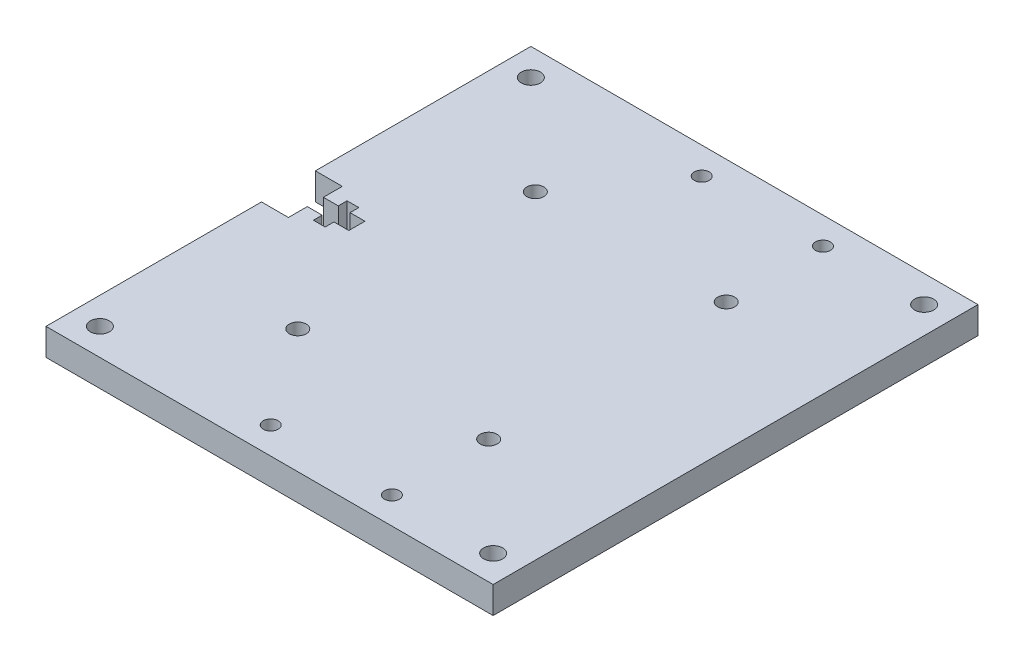
ISO-10303-21;
HEADER;
FILE_DESCRIPTION(('STEP AP214'),'2;1');
FILE_NAME('part.step','',(''),(''),'','','');
FILE_SCHEMA(('AUTOMOTIVE_DESIGN { 1 0 10303 214 1 1 1 1 }'));
ENDSEC;
DATA;
#1=APPLICATION_CONTEXT('core data for automotive mechanical design processes');
#2=APPLICATION_PROTOCOL_DEFINITION('international standard','automotive_design',2000,#1);
#3=PRODUCT_CONTEXT('',#1,'mechanical');
#4=PRODUCT('Part','Part','',(#3));
#5=PRODUCT_RELATED_PRODUCT_CATEGORY('part','',(#4));
#6=PRODUCT_DEFINITION_FORMATION('','',#4);
#7=PRODUCT_DEFINITION_CONTEXT('part definition',#1,'design');
#8=PRODUCT_DEFINITION('design','',#6,#7);
#9=PRODUCT_DEFINITION_SHAPE('','',#8);
#10=(LENGTH_UNIT() NAMED_UNIT(*) SI_UNIT(.MILLI.,.METRE.));
#11=(NAMED_UNIT(*) PLANE_ANGLE_UNIT() SI_UNIT($,.RADIAN.));
#12=(NAMED_UNIT(*) SI_UNIT($,.STERADIAN.) SOLID_ANGLE_UNIT());
#13=UNCERTAINTY_MEASURE_WITH_UNIT(LENGTH_MEASURE(1.E-05),#10,'distance_accuracy_value','');
#14=(GEOMETRIC_REPRESENTATION_CONTEXT(3) GLOBAL_UNCERTAINTY_ASSIGNED_CONTEXT((#13)) GLOBAL_UNIT_ASSIGNED_CONTEXT((#10,
#11,#12)) REPRESENTATION_CONTEXT('',''));
#15=CARTESIAN_POINT('',(0.,0.,0.));
#16=DIRECTION('',(0.,0.,1.));
#17=DIRECTION('',(1.,0.,0.));
#18=AXIS2_PLACEMENT_3D('',#15,#16,#17);
#19=CARTESIAN_POINT('',(0.,3.175,0.));
#20=DIRECTION('',(0.,-1.,0.));
#21=DIRECTION('',(0.,0.,-1.));
#22=AXIS2_PLACEMENT_3D('',#19,#20,#21);
#23=PLANE('',#22);
#24=CARTESIAN_POINT('',(22.5,3.175,-50.8));
#25=DIRECTION('',(0.,1.,0.));
#26=DIRECTION('',(0.,0.,1.));
#27=AXIS2_PLACEMENT_3D('',#24,#25,#26);
#28=CIRCLE('',#27,1.7526);
#29=CARTESIAN_POINT('',(22.5,3.175,-49.0474));
#30=VERTEX_POINT('',#29);
#31=EDGE_CURVE('E450',#30,#30,#28,.T.);
#32=ORIENTED_EDGE('',*,*,#31,.F.);
#33=EDGE_LOOP('',(#32));
#34=FACE_BOUND('',#33,.T.);
#35=CARTESIAN_POINT('',(-6.075,3.175,-50.8));
#36=DIRECTION('',(0.,1.,0.));
#37=DIRECTION('',(0.,0.,1.));
#38=AXIS2_PLACEMENT_3D('',#35,#36,#37);
#39=CIRCLE('',#38,1.7526);
#40=CARTESIAN_POINT('',(-6.075,3.175,-49.0474));
#41=VERTEX_POINT('',#40);
#42=EDGE_CURVE('E456',#41,#41,#39,.T.);
#43=ORIENTED_EDGE('',*,*,#42,.F.);
#44=EDGE_LOOP('',(#43));
#45=FACE_BOUND('',#44,.T.);
#46=CARTESIAN_POINT('',(-46.355,3.175,-50.8));
#47=DIRECTION('',(0.,1.,0.));
#48=DIRECTION('',(0.,0.,1.));
#49=AXIS2_PLACEMENT_3D('',#46,#47,#48);
#50=CIRCLE('',#49,2.24789999999999);
#51=CARTESIAN_POINT('',(-46.355,3.175,-48.5521));
#52=VERTEX_POINT('',#51);
#53=EDGE_CURVE('E477',#52,#52,#50,.T.);
#54=ORIENTED_EDGE('',*,*,#53,.F.);
#55=EDGE_LOOP('',(#54));
#56=FACE_BOUND('',#55,.T.);
#57=CARTESIAN_POINT('',(22.5,3.175,28.));
#58=DIRECTION('',(0.,1.,0.));
#59=DIRECTION('',(0.,0.,1.));
#60=AXIS2_PLACEMENT_3D('',#57,#58,#59);
#61=CIRCLE('',#60,2.);
#62=CARTESIAN_POINT('',(22.5,3.175,30.));
#63=VERTEX_POINT('',#62);
#64=EDGE_CURVE('E485',#63,#63,#61,.T.);
#65=ORIENTED_EDGE('',*,*,#64,.F.);
#66=EDGE_LOOP('',(#65));
#67=FACE_BOUND('',#66,.T.);
#68=CARTESIAN_POINT('',(22.5,3.175,-28.));
#69=DIRECTION('',(0.,1.,0.));
#70=DIRECTION('',(0.,0.,1.));
#71=AXIS2_PLACEMENT_3D('',#68,#69,#70);
#72=CIRCLE('',#71,2.);
#73=CARTESIAN_POINT('',(22.5,3.175,-26.));
#74=VERTEX_POINT('',#73);
#75=EDGE_CURVE('E491',#74,#74,#72,.T.);
#76=ORIENTED_EDGE('',*,*,#75,.F.);
#77=EDGE_LOOP('',(#76));
#78=FACE_BOUND('',#77,.T.);
#79=DIRECTION('',(0.,0.,-1.));
#80=VECTOR('',#79,1.);
#81=CARTESIAN_POINT('',(-46.355,3.175,6.35));
#82=LINE('',#81,#80);
#83=CARTESIAN_POINT('',(-46.355,3.175,6.35));
#84=VERTEX_POINT('',#83);
#85=CARTESIAN_POINT('',(-46.355,3.175,1.89865));
#86=VERTEX_POINT('',#85);
#87=EDGE_CURVE('E357',#84,#86,#82,.T.);
#88=ORIENTED_EDGE('',*,*,#87,.F.);
#89=DIRECTION('',(1.,0.,0.));
#90=VECTOR('',#89,1.);
#91=CARTESIAN_POINT('',(-52.705,3.175,6.35000000000001));
#92=LINE('',#91,#90);
#93=CARTESIAN_POINT('',(-52.705,3.175,6.35000000000001));
#94=VERTEX_POINT('',#93);
#95=EDGE_CURVE('E353',#94,#84,#92,.T.);
#96=ORIENTED_EDGE('',*,*,#95,.F.);
#97=DIRECTION('',(0.,0.,1.));
#98=VECTOR('',#97,1.);
#99=CARTESIAN_POINT('',(-52.705,3.175,57.15));
#100=LINE('',#99,#98);
#101=CARTESIAN_POINT('',(-52.705,3.175,57.15));
#102=VERTEX_POINT('',#101);
#103=EDGE_CURVE('E504',#94,#102,#100,.T.);
#104=ORIENTED_EDGE('',*,*,#103,.T.);
#105=DIRECTION('',(1.,0.,0.));
#106=VECTOR('',#105,1.);
#107=CARTESIAN_POINT('',(-52.705,3.175,57.15));
#108=LINE('',#107,#106);
#109=CARTESIAN_POINT('',(52.705,3.175,57.15));
#110=VERTEX_POINT('',#109);
#111=EDGE_CURVE('E67',#102,#110,#108,.T.);
#112=ORIENTED_EDGE('',*,*,#111,.T.);
#113=DIRECTION('',(0.,0.,-1.));
#114=VECTOR('',#113,1.);
#115=CARTESIAN_POINT('',(52.705,3.175,57.15));
#116=LINE('',#115,#114);
#117=CARTESIAN_POINT('',(52.705,3.175,-57.15));
#118=VERTEX_POINT('',#117);
#119=EDGE_CURVE('E247',#110,#118,#116,.T.);
#120=ORIENTED_EDGE('',*,*,#119,.T.);
#121=DIRECTION('',(-1.,0.,0.));
#122=VECTOR('',#121,1.);
#123=CARTESIAN_POINT('',(-52.705,3.175,-57.15));
#124=LINE('',#123,#122);
#125=CARTESIAN_POINT('',(-52.705,3.175,-57.15));
#126=VERTEX_POINT('',#125);
#127=EDGE_CURVE('E97',#118,#126,#124,.T.);
#128=ORIENTED_EDGE('',*,*,#127,.T.);
#129=CARTESIAN_POINT('',(-52.705,3.175,-6.34999999999999));
#130=VERTEX_POINT('',#129);
#131=EDGE_CURVE('E505',#126,#130,#100,.T.);
#132=ORIENTED_EDGE('',*,*,#131,.T.);
#133=DIRECTION('',(-1.,0.,0.));
#134=VECTOR('',#133,1.);
#135=CARTESIAN_POINT('',(-52.705,3.175,-6.34999999999999));
#136=LINE('',#135,#134);
#137=CARTESIAN_POINT('',(-46.355,3.175,-6.34999999999999));
#138=VERTEX_POINT('',#137);
#139=EDGE_CURVE('E218',#138,#130,#136,.T.);
#140=ORIENTED_EDGE('',*,*,#139,.F.);
#141=DIRECTION('',(0.,0.,-1.));
#142=VECTOR('',#141,1.);
#143=CARTESIAN_POINT('',(-46.355,3.175,-1.89864999999999));
#144=LINE('',#143,#142);
#145=CARTESIAN_POINT('',(-46.355,3.175,-1.89864999999999));
#146=VERTEX_POINT('',#145);
#147=EDGE_CURVE('E399',#146,#138,#144,.T.);
#148=ORIENTED_EDGE('',*,*,#147,.F.);
#149=DIRECTION('',(-1.,0.,0.));
#150=VECTOR('',#149,1.);
#151=CARTESIAN_POINT('',(-46.355,3.175,-1.89864999999999));
#152=LINE('',#151,#150);
#153=CARTESIAN_POINT('',(-42.8545625,3.175,-1.89864999999999));
#154=VERTEX_POINT('',#153);
#155=EDGE_CURVE('E395',#154,#146,#152,.T.);
#156=ORIENTED_EDGE('',*,*,#155,.F.);
#157=DIRECTION('',(0.,0.,1.));
#158=VECTOR('',#157,1.);
#159=CARTESIAN_POINT('',(-42.8545625,3.175,-1.89864999999999));
#160=LINE('',#159,#158);
#161=CARTESIAN_POINT('',(-42.8545625,3.175,-3.96874999999999));
#162=VERTEX_POINT('',#161);
#163=EDGE_CURVE('E391',#162,#154,#160,.T.);
#164=ORIENTED_EDGE('',*,*,#163,.F.);
#165=DIRECTION('',(-1.,0.,0.));
#166=VECTOR('',#165,1.);
#167=CARTESIAN_POINT('',(-42.8545625,3.175,-3.96874999999999));
#168=LINE('',#167,#166);
#169=CARTESIAN_POINT('',(-40.0764375,3.175,-3.96874999999999));
#170=VERTEX_POINT('',#169);
#171=EDGE_CURVE('E387',#170,#162,#168,.T.);
#172=ORIENTED_EDGE('',*,*,#171,.F.);
#173=DIRECTION('',(0.,0.,-1.));
#174=VECTOR('',#173,1.);
#175=CARTESIAN_POINT('',(-40.0764375,3.175,-3.96874999999999));
#176=LINE('',#175,#174);
#177=CARTESIAN_POINT('',(-40.0764375,3.175,-1.89864999999999));
#178=VERTEX_POINT('',#177);
#179=EDGE_CURVE('E384',#178,#170,#176,.T.);
#180=ORIENTED_EDGE('',*,*,#179,.F.);
#181=DIRECTION('',(-1.,0.,0.));
#182=VECTOR('',#181,1.);
#183=CARTESIAN_POINT('',(-40.0764375,3.175,-1.89864999999999));
#184=LINE('',#183,#182);
#185=CARTESIAN_POINT('',(-36.576,3.175,-1.89864999999999));
#186=VERTEX_POINT('',#185);
#187=EDGE_CURVE('E381',#186,#178,#184,.T.);
#188=ORIENTED_EDGE('',*,*,#187,.F.);
#189=DIRECTION('',(0.,0.,-1.));
#190=VECTOR('',#189,1.);
#191=CARTESIAN_POINT('',(-36.576,3.175,-1.89864999999999));
#192=LINE('',#191,#190);
#193=CARTESIAN_POINT('',(-36.576,3.175,1.89865000000001));
#194=VERTEX_POINT('',#193);
#195=EDGE_CURVE('E378',#194,#186,#192,.T.);
#196=ORIENTED_EDGE('',*,*,#195,.F.);
#197=DIRECTION('',(1.,0.,0.));
#198=VECTOR('',#197,1.);
#199=CARTESIAN_POINT('',(-40.0764375,3.175,1.89865));
#200=LINE('',#199,#198);
#201=CARTESIAN_POINT('',(-40.0764375,3.175,1.89865));
#202=VERTEX_POINT('',#201);
#203=EDGE_CURVE('E375',#202,#194,#200,.T.);
#204=ORIENTED_EDGE('',*,*,#203,.F.);
#205=DIRECTION('',(0.,0.,-1.));
#206=VECTOR('',#205,1.);
#207=CARTESIAN_POINT('',(-40.0764375,3.175,3.96875000000001));
#208=LINE('',#207,#206);
#209=CARTESIAN_POINT('',(-40.0764375,3.175,3.96875000000001));
#210=VERTEX_POINT('',#209);
#211=EDGE_CURVE('E372',#210,#202,#208,.T.);
#212=ORIENTED_EDGE('',*,*,#211,.F.);
#213=DIRECTION('',(1.,0.,0.));
#214=VECTOR('',#213,1.);
#215=CARTESIAN_POINT('',(-42.8545625,3.175,3.96875000000001));
#216=LINE('',#215,#214);
#217=CARTESIAN_POINT('',(-42.8545625,3.175,3.96875000000001));
#218=VERTEX_POINT('',#217);
#219=EDGE_CURVE('E368',#218,#210,#216,.T.);
#220=ORIENTED_EDGE('',*,*,#219,.F.);
#221=DIRECTION('',(0.,0.,1.));
#222=VECTOR('',#221,1.);
#223=CARTESIAN_POINT('',(-42.8545625,3.175,1.89865));
#224=LINE('',#223,#222);
#225=CARTESIAN_POINT('',(-42.8545625,3.175,1.89865));
#226=VERTEX_POINT('',#225);
#227=EDGE_CURVE('E364',#226,#218,#224,.T.);
#228=ORIENTED_EDGE('',*,*,#227,.F.);
#229=DIRECTION('',(1.,0.,0.));
#230=VECTOR('',#229,1.);
#231=CARTESIAN_POINT('',(-46.355,3.175,1.89865));
#232=LINE('',#231,#230);
#233=EDGE_CURVE('E360',#86,#226,#232,.T.);
#234=ORIENTED_EDGE('',*,*,#233,.F.);
#235=EDGE_LOOP('',(#88,#96,#104,#112,#120,#128,#132,#140,#148,#156,#164,#172,#180,#188,#196,
#204,#212,#220,#228,#234));
#236=FACE_BOUND('',#235,.T.);
#237=CARTESIAN_POINT('',(-22.5,3.175,-28.));
#238=DIRECTION('',(0.,1.,0.));
#239=DIRECTION('',(0.,0.,1.));
#240=AXIS2_PLACEMENT_3D('',#237,#238,#239);
#241=CIRCLE('',#240,2.);
#242=CARTESIAN_POINT('',(-22.5,3.175,-26.));
#243=VERTEX_POINT('',#242);
#244=EDGE_CURVE('E262',#243,#243,#241,.T.);
#245=ORIENTED_EDGE('',*,*,#244,.F.);
#246=EDGE_LOOP('',(#245));
#247=FACE_BOUND('',#246,.T.);
#248=CARTESIAN_POINT('',(-22.5,3.175,28.));
#249=DIRECTION('',(0.,1.,0.));
#250=DIRECTION('',(0.,0.,1.));
#251=AXIS2_PLACEMENT_3D('',#248,#249,#250);
#252=CIRCLE('',#251,2.);
#253=CARTESIAN_POINT('',(-22.5,3.175,30.));
#254=VERTEX_POINT('',#253);
#255=EDGE_CURVE('E46',#254,#254,#252,.T.);
#256=ORIENTED_EDGE('',*,*,#255,.F.);
#257=EDGE_LOOP('',(#256));
#258=FACE_BOUND('',#257,.T.);
#259=CARTESIAN_POINT('',(-46.355,3.175,50.8));
#260=DIRECTION('',(0.,1.,0.));
#261=DIRECTION('',(0.,0.,1.));
#262=AXIS2_PLACEMENT_3D('',#259,#260,#261);
#263=CIRCLE('',#262,2.24789999999999);
#264=CARTESIAN_POINT('',(-46.355,3.175,53.0479));
#265=VERTEX_POINT('',#264);
#266=EDGE_CURVE('E280',#265,#265,#263,.T.);
#267=ORIENTED_EDGE('',*,*,#266,.F.);
#268=EDGE_LOOP('',(#267));
#269=FACE_BOUND('',#268,.T.);
#270=CARTESIAN_POINT('',(46.355,3.175,50.8));
#271=DIRECTION('',(0.,1.,0.));
#272=DIRECTION('',(0.,0.,1.));
#273=AXIS2_PLACEMENT_3D('',#270,#271,#272);
#274=CIRCLE('',#273,2.24789999999999);
#275=CARTESIAN_POINT('',(46.355,3.175,53.0479));
#276=VERTEX_POINT('',#275);
#277=EDGE_CURVE('E284',#276,#276,#274,.T.);
#278=ORIENTED_EDGE('',*,*,#277,.F.);
#279=EDGE_LOOP('',(#278));
#280=FACE_BOUND('',#279,.T.);
#281=CARTESIAN_POINT('',(46.355,3.175,-50.8));
#282=DIRECTION('',(0.,1.,0.));
#283=DIRECTION('',(0.,0.,1.));
#284=AXIS2_PLACEMENT_3D('',#281,#282,#283);
#285=CIRCLE('',#284,2.24789999999999);
#286=CARTESIAN_POINT('',(46.355,3.175,-48.5521));
#287=VERTEX_POINT('',#286);
#288=EDGE_CURVE('E288',#287,#287,#285,.T.);
#289=ORIENTED_EDGE('',*,*,#288,.F.);
#290=EDGE_LOOP('',(#289));
#291=FACE_BOUND('',#290,.T.);
#292=CARTESIAN_POINT('',(-6.075,3.175,50.8));
#293=DIRECTION('',(0.,1.,0.));
#294=DIRECTION('',(0.,0.,1.));
#295=AXIS2_PLACEMENT_3D('',#292,#293,#294);
#296=CIRCLE('',#295,1.7526);
#297=CARTESIAN_POINT('',(-6.075,3.175,52.5526));
#298=VERTEX_POINT('',#297);
#299=EDGE_CURVE('E292',#298,#298,#296,.T.);
#300=ORIENTED_EDGE('',*,*,#299,.F.);
#301=EDGE_LOOP('',(#300));
#302=FACE_BOUND('',#301,.T.);
#303=CARTESIAN_POINT('',(22.5,3.175,50.8));
#304=DIRECTION('',(0.,1.,0.));
#305=DIRECTION('',(0.,0.,1.));
#306=AXIS2_PLACEMENT_3D('',#303,#304,#305);
#307=CIRCLE('',#306,1.7526);
#308=CARTESIAN_POINT('',(22.5,3.175,52.5526));
#309=VERTEX_POINT('',#308);
#310=EDGE_CURVE('E295',#309,#309,#307,.T.);
#311=ORIENTED_EDGE('',*,*,#310,.F.);
#312=EDGE_LOOP('',(#311));
#313=FACE_BOUND('',#312,.T.);
#314=ADVANCED_FACE('F38',(#34,#45,#56,#67,#78,#236,#247,#258,#269,#280,#291,#302,#313),#23,.F.);
#315=CARTESIAN_POINT('',(-52.705,3.175,57.15));
#316=DIRECTION('',(1.,0.,0.));
#317=DIRECTION('',(0.,0.,-1.));
#318=AXIS2_PLACEMENT_3D('',#315,#316,#317);
#319=PLANE('',#318);
#320=ORIENTED_EDGE('',*,*,#103,.F.);
#321=DIRECTION('',(0.,1.,0.));
#322=VECTOR('',#321,1.);
#323=CARTESIAN_POINT('',(-52.705,-3.176,6.35000000000001));
#324=LINE('',#323,#322);
#325=CARTESIAN_POINT('',(-52.705,-3.175,6.35000000000001));
#326=VERTEX_POINT('',#325);
#327=EDGE_CURVE('E224',#326,#94,#324,.T.);
#328=ORIENTED_EDGE('',*,*,#327,.F.);
#329=DIRECTION('',(0.,0.,1.));
#330=VECTOR('',#329,1.);
#331=CARTESIAN_POINT('',(-52.705,-3.175,57.15));
#332=LINE('',#331,#330);
#333=CARTESIAN_POINT('',(-52.705,-3.175,57.15));
#334=VERTEX_POINT('',#333);
#335=EDGE_CURVE('E243',#326,#334,#332,.T.);
#336=ORIENTED_EDGE('',*,*,#335,.T.);
#337=DIRECTION('',(0.,-1.,0.));
#338=VECTOR('',#337,1.);
#339=CARTESIAN_POINT('',(-52.705,3.175,57.15));
#340=LINE('',#339,#338);
#341=EDGE_CURVE('E257',#102,#334,#340,.T.);
#342=ORIENTED_EDGE('',*,*,#341,.F.);
#343=EDGE_LOOP('',(#320,#328,#336,#342));
#344=FACE_BOUND('',#343,.T.);
#345=ADVANCED_FACE('F274',(#344),#319,.F.);
#346=CARTESIAN_POINT('',(52.705,3.175,57.15));
#347=DIRECTION('',(-1.,0.,0.));
#348=DIRECTION('',(0.,0.,1.));
#349=AXIS2_PLACEMENT_3D('',#346,#347,#348);
#350=PLANE('',#349);
#351=DIRECTION('',(0.,0.,-1.));
#352=VECTOR('',#351,1.);
#353=CARTESIAN_POINT('',(52.705,-3.175,57.15));
#354=LINE('',#353,#352);
#355=CARTESIAN_POINT('',(52.705,-3.175,57.15));
#356=VERTEX_POINT('',#355);
#357=CARTESIAN_POINT('',(52.705,-3.175,-57.15));
#358=VERTEX_POINT('',#357);
#359=EDGE_CURVE('E499',#356,#358,#354,.T.);
#360=ORIENTED_EDGE('',*,*,#359,.T.);
#361=DIRECTION('',(0.,-1.,0.));
#362=VECTOR('',#361,1.);
#363=CARTESIAN_POINT('',(52.705,3.175,-57.15));
#364=LINE('',#363,#362);
#365=EDGE_CURVE('E260',#118,#358,#364,.T.);
#366=ORIENTED_EDGE('',*,*,#365,.F.);
#367=ORIENTED_EDGE('',*,*,#119,.F.);
#368=DIRECTION('',(0.,-1.,0.));
#369=VECTOR('',#368,1.);
#370=CARTESIAN_POINT('',(52.705,3.175,57.15));
#371=LINE('',#370,#369);
#372=EDGE_CURVE('E254',#110,#356,#371,.T.);
#373=ORIENTED_EDGE('',*,*,#372,.T.);
#374=EDGE_LOOP('',(#360,#366,#367,#373));
#375=FACE_BOUND('',#374,.T.);
#376=ADVANCED_FACE('F523',(#375),#350,.F.);
#377=CARTESIAN_POINT('',(-52.705,3.175,-57.15));
#378=DIRECTION('',(0.,0.,1.));
#379=DIRECTION('',(1.,0.,0.));
#380=AXIS2_PLACEMENT_3D('',#377,#378,#379);
#381=PLANE('',#380);
#382=DIRECTION('',(-1.,0.,0.));
#383=VECTOR('',#382,1.);
#384=CARTESIAN_POINT('',(-52.705,-3.175,-57.15));
#385=LINE('',#384,#383);
#386=CARTESIAN_POINT('',(-52.705,-3.175,-57.15));
#387=VERTEX_POINT('',#386);
#388=EDGE_CURVE('E250',#358,#387,#385,.T.);
#389=ORIENTED_EDGE('',*,*,#388,.T.);
#390=DIRECTION('',(0.,-1.,0.));
#391=VECTOR('',#390,1.);
#392=CARTESIAN_POINT('',(-52.705,3.175,-57.15));
#393=LINE('',#392,#391);
#394=EDGE_CURVE('E241',#126,#387,#393,.T.);
#395=ORIENTED_EDGE('',*,*,#394,.F.);
#396=ORIENTED_EDGE('',*,*,#127,.F.);
#397=ORIENTED_EDGE('',*,*,#365,.T.);
#398=EDGE_LOOP('',(#389,#395,#396,#397));
#399=FACE_BOUND('',#398,.T.);
#400=ADVANCED_FACE('F515',(#399),#381,.F.);
#401=CARTESIAN_POINT('',(-52.705,-3.175,-6.34999999999999));
#402=VERTEX_POINT('',#401);
#403=EDGE_CURVE('E233',#387,#402,#332,.T.);
#404=ORIENTED_EDGE('',*,*,#403,.T.);
#405=DIRECTION('',(0.,1.,0.));
#406=VECTOR('',#405,1.);
#407=CARTESIAN_POINT('',(-52.705,-3.176,-6.34999999999999));
#408=LINE('',#407,#406);
#409=EDGE_CURVE('E212',#402,#130,#408,.T.);
#410=ORIENTED_EDGE('',*,*,#409,.T.);
#411=ORIENTED_EDGE('',*,*,#131,.F.);
#412=ORIENTED_EDGE('',*,*,#394,.T.);
#413=EDGE_LOOP('',(#404,#410,#411,#412));
#414=FACE_BOUND('',#413,.T.);
#415=ADVANCED_FACE('F240',(#414),#319,.F.);
#416=CARTESIAN_POINT('',(-52.705,3.175,57.15));
#417=DIRECTION('',(0.,0.,-1.));
#418=DIRECTION('',(-1.,0.,0.));
#419=AXIS2_PLACEMENT_3D('',#416,#417,#418);
#420=PLANE('',#419);
#421=DIRECTION('',(1.,0.,0.));
#422=VECTOR('',#421,1.);
#423=CARTESIAN_POINT('',(-52.705,-3.175,57.15));
#424=LINE('',#423,#422);
#425=EDGE_CURVE('E89',#334,#356,#424,.T.);
#426=ORIENTED_EDGE('',*,*,#425,.T.);
#427=ORIENTED_EDGE('',*,*,#372,.F.);
#428=ORIENTED_EDGE('',*,*,#111,.F.);
#429=ORIENTED_EDGE('',*,*,#341,.T.);
#430=EDGE_LOOP('',(#426,#427,#428,#429));
#431=FACE_BOUND('',#430,.T.);
#432=ADVANCED_FACE('F521',(#431),#420,.F.);
#433=CARTESIAN_POINT('',(0.,-3.175,0.));
#434=DIRECTION('',(0.,-1.,0.));
#435=DIRECTION('',(0.,0.,-1.));
#436=AXIS2_PLACEMENT_3D('',#433,#434,#435);
#437=PLANE('',#436);
#438=CARTESIAN_POINT('',(22.5,-3.175,50.8));
#439=DIRECTION('',(0.,1.,0.));
#440=DIRECTION('',(0.,0.,1.));
#441=AXIS2_PLACEMENT_3D('',#438,#439,#440);
#442=CIRCLE('',#441,1.7526);
#443=CARTESIAN_POINT('',(22.5,-3.175,52.5526));
#444=VERTEX_POINT('',#443);
#445=EDGE_CURVE('E297',#444,#444,#442,.T.);
#446=ORIENTED_EDGE('',*,*,#445,.T.);
#447=EDGE_LOOP('',(#446));
#448=FACE_BOUND('',#447,.T.);
#449=CARTESIAN_POINT('',(-6.075,-3.175,50.8));
#450=DIRECTION('',(0.,1.,0.));
#451=DIRECTION('',(0.,0.,1.));
#452=AXIS2_PLACEMENT_3D('',#449,#450,#451);
#453=CIRCLE('',#452,1.7526);
#454=CARTESIAN_POINT('',(-6.075,-3.175,52.5526));
#455=VERTEX_POINT('',#454);
#456=EDGE_CURVE('E303',#455,#455,#453,.T.);
#457=ORIENTED_EDGE('',*,*,#456,.T.);
#458=EDGE_LOOP('',(#457));
#459=FACE_BOUND('',#458,.T.);
#460=DIRECTION('',(1.,0.,0.));
#461=VECTOR('',#460,1.);
#462=CARTESIAN_POINT('',(-52.705,-3.175,6.35000000000001));
#463=LINE('',#462,#461);
#464=CARTESIAN_POINT('',(-46.355,-3.175,6.35));
#465=VERTEX_POINT('',#464);
#466=EDGE_CURVE('E237',#326,#465,#463,.T.);
#467=ORIENTED_EDGE('',*,*,#466,.T.);
#468=DIRECTION('',(0.,0.,-1.));
#469=VECTOR('',#468,1.);
#470=CARTESIAN_POINT('',(-46.355,-3.175,6.35));
#471=LINE('',#470,#469);
#472=CARTESIAN_POINT('',(-46.355,-3.175,1.89865));
#473=VERTEX_POINT('',#472);
#474=EDGE_CURVE('E407',#465,#473,#471,.T.);
#475=ORIENTED_EDGE('',*,*,#474,.T.);
#476=DIRECTION('',(1.,0.,0.));
#477=VECTOR('',#476,1.);
#478=CARTESIAN_POINT('',(-46.355,-3.175,1.89865));
#479=LINE('',#478,#477);
#480=CARTESIAN_POINT('',(-42.8545625,-3.175,1.89865));
#481=VERTEX_POINT('',#480);
#482=EDGE_CURVE('E306',#473,#481,#479,.T.);
#483=ORIENTED_EDGE('',*,*,#482,.T.);
#484=DIRECTION('',(0.,0.,1.));
#485=VECTOR('',#484,1.);
#486=CARTESIAN_POINT('',(-42.8545625,-3.175,1.89865));
#487=LINE('',#486,#485);
#488=CARTESIAN_POINT('',(-42.8545625,-3.175,3.96875000000001));
#489=VERTEX_POINT('',#488);
#490=EDGE_CURVE('E310',#481,#489,#487,.T.);
#491=ORIENTED_EDGE('',*,*,#490,.T.);
#492=DIRECTION('',(1.,0.,0.));
#493=VECTOR('',#492,1.);
#494=CARTESIAN_POINT('',(-42.8545625,-3.175,3.96875000000001));
#495=LINE('',#494,#493);
#496=CARTESIAN_POINT('',(-40.0764375,-3.175,3.96875000000001));
#497=VERTEX_POINT('',#496);
#498=EDGE_CURVE('E314',#489,#497,#495,.T.);
#499=ORIENTED_EDGE('',*,*,#498,.T.);
#500=DIRECTION('',(0.,0.,-1.));
#501=VECTOR('',#500,1.);
#502=CARTESIAN_POINT('',(-40.0764375,-3.175,3.96875000000001));
#503=LINE('',#502,#501);
#504=CARTESIAN_POINT('',(-40.0764375,-3.175,1.89865));
#505=VERTEX_POINT('',#504);
#506=EDGE_CURVE('E318',#497,#505,#503,.T.);
#507=ORIENTED_EDGE('',*,*,#506,.T.);
#508=DIRECTION('',(1.,0.,0.));
#509=VECTOR('',#508,1.);
#510=CARTESIAN_POINT('',(-40.0764375,-3.175,1.89865));
#511=LINE('',#510,#509);
#512=CARTESIAN_POINT('',(-36.576,-3.175,1.89865000000001));
#513=VERTEX_POINT('',#512);
#514=EDGE_CURVE('E322',#505,#513,#511,.T.);
#515=ORIENTED_EDGE('',*,*,#514,.T.);
#516=DIRECTION('',(0.,0.,-1.));
#517=VECTOR('',#516,1.);
#518=CARTESIAN_POINT('',(-36.576,-3.175,-1.89864999999999));
#519=LINE('',#518,#517);
#520=CARTESIAN_POINT('',(-36.576,-3.175,-1.89864999999999));
#521=VERTEX_POINT('',#520);
#522=EDGE_CURVE('E326',#513,#521,#519,.T.);
#523=ORIENTED_EDGE('',*,*,#522,.T.);
#524=DIRECTION('',(-1.,0.,0.));
#525=VECTOR('',#524,1.);
#526=CARTESIAN_POINT('',(-40.0764375,-3.175,-1.89864999999999));
#527=LINE('',#526,#525);
#528=CARTESIAN_POINT('',(-40.0764375,-3.175,-1.89864999999999));
#529=VERTEX_POINT('',#528);
#530=EDGE_CURVE('E330',#521,#529,#527,.T.);
#531=ORIENTED_EDGE('',*,*,#530,.T.);
#532=DIRECTION('',(0.,0.,-1.));
#533=VECTOR('',#532,1.);
#534=CARTESIAN_POINT('',(-40.0764375,-3.175,-3.96874999999999));
#535=LINE('',#534,#533);
#536=CARTESIAN_POINT('',(-40.0764375,-3.175,-3.96874999999999));
#537=VERTEX_POINT('',#536);
#538=EDGE_CURVE('E334',#529,#537,#535,.T.);
#539=ORIENTED_EDGE('',*,*,#538,.T.);
#540=DIRECTION('',(-1.,0.,0.));
#541=VECTOR('',#540,1.);
#542=CARTESIAN_POINT('',(-42.8545625,-3.175,-3.96874999999999));
#543=LINE('',#542,#541);
#544=CARTESIAN_POINT('',(-42.8545625,-3.175,-3.96874999999999));
#545=VERTEX_POINT('',#544);
#546=EDGE_CURVE('E338',#537,#545,#543,.T.);
#547=ORIENTED_EDGE('',*,*,#546,.T.);
#548=DIRECTION('',(0.,0.,1.));
#549=VECTOR('',#548,1.);
#550=CARTESIAN_POINT('',(-42.8545625,-3.175,-1.89864999999999));
#551=LINE('',#550,#549);
#552=CARTESIAN_POINT('',(-42.8545625,-3.175,-1.89864999999999));
#553=VERTEX_POINT('',#552);
#554=EDGE_CURVE('E342',#545,#553,#551,.T.);
#555=ORIENTED_EDGE('',*,*,#554,.T.);
#556=DIRECTION('',(-1.,0.,0.));
#557=VECTOR('',#556,1.);
#558=CARTESIAN_POINT('',(-46.355,-3.175,-1.89864999999999));
#559=LINE('',#558,#557);
#560=CARTESIAN_POINT('',(-46.355,-3.175,-1.89864999999999));
#561=VERTEX_POINT('',#560);
#562=EDGE_CURVE('E346',#553,#561,#559,.T.);
#563=ORIENTED_EDGE('',*,*,#562,.T.);
#564=DIRECTION('',(0.,0.,-1.));
#565=VECTOR('',#564,1.);
#566=CARTESIAN_POINT('',(-46.355,-3.175,-1.89864999999999));
#567=LINE('',#566,#565);
#568=CARTESIAN_POINT('',(-46.355,-3.175,-6.34999999999999));
#569=VERTEX_POINT('',#568);
#570=EDGE_CURVE('E235',#561,#569,#567,.T.);
#571=ORIENTED_EDGE('',*,*,#570,.T.);
#572=DIRECTION('',(-1.,0.,0.));
#573=VECTOR('',#572,1.);
#574=CARTESIAN_POINT('',(-52.705,-3.175,-6.34999999999999));
#575=LINE('',#574,#573);
#576=EDGE_CURVE('E215',#569,#402,#575,.T.);
#577=ORIENTED_EDGE('',*,*,#576,.T.);
#578=ORIENTED_EDGE('',*,*,#403,.F.);
#579=ORIENTED_EDGE('',*,*,#388,.F.);
#580=ORIENTED_EDGE('',*,*,#359,.F.);
#581=ORIENTED_EDGE('',*,*,#425,.F.);
#582=ORIENTED_EDGE('',*,*,#335,.F.);
#583=EDGE_LOOP('',(#467,#475,#483,#491,#499,#507,#515,#523,#531,#539,#547,#555,#563,#571,#577,
#578,#579,#580,#581,#582));
#584=FACE_BOUND('',#583,.T.);
#585=CARTESIAN_POINT('',(22.5,-3.175,-50.8));
#586=DIRECTION('',(0.,1.,0.));
#587=DIRECTION('',(0.,0.,1.));
#588=AXIS2_PLACEMENT_3D('',#585,#586,#587);
#589=CIRCLE('',#588,1.7526);
#590=CARTESIAN_POINT('',(22.5,-3.175,-49.0474));
#591=VERTEX_POINT('',#590);
#592=EDGE_CURVE('E453',#591,#591,#589,.T.);
#593=ORIENTED_EDGE('',*,*,#592,.T.);
#594=EDGE_LOOP('',(#593));
#595=FACE_BOUND('',#594,.T.);
#596=CARTESIAN_POINT('',(-6.075,-3.175,-50.8));
#597=DIRECTION('',(0.,1.,0.));
#598=DIRECTION('',(0.,0.,1.));
#599=AXIS2_PLACEMENT_3D('',#596,#597,#598);
#600=CIRCLE('',#599,1.7526);
#601=CARTESIAN_POINT('',(-6.075,-3.175,-49.0474));
#602=VERTEX_POINT('',#601);
#603=EDGE_CURVE('E459',#602,#602,#600,.T.);
#604=ORIENTED_EDGE('',*,*,#603,.T.);
#605=EDGE_LOOP('',(#604));
#606=FACE_BOUND('',#605,.T.);
#607=CARTESIAN_POINT('',(46.355,-3.175,-50.8));
#608=DIRECTION('',(0.,-1.,0.));
#609=DIRECTION('',(0.,0.,-1.));
#610=AXIS2_PLACEMENT_3D('',#607,#608,#609);
#611=CIRCLE('',#610,2.24789999999999);
#612=CARTESIAN_POINT('',(46.355,-3.175,-53.0479));
#613=VERTEX_POINT('',#612);
#614=EDGE_CURVE('E464',#613,#613,#611,.T.);
#615=ORIENTED_EDGE('',*,*,#614,.F.);
#616=EDGE_LOOP('',(#615));
#617=FACE_BOUND('',#616,.T.);
#618=CARTESIAN_POINT('',(46.355,-3.175,50.8));
#619=DIRECTION('',(0.,-1.,0.));
#620=DIRECTION('',(0.,0.,-1.));
#621=AXIS2_PLACEMENT_3D('',#618,#619,#620);
#622=CIRCLE('',#621,2.24789999999999);
#623=CARTESIAN_POINT('',(46.355,-3.175,48.5521));
#624=VERTEX_POINT('',#623);
#625=EDGE_CURVE('E469',#624,#624,#622,.T.);
#626=ORIENTED_EDGE('',*,*,#625,.F.);
#627=EDGE_LOOP('',(#626));
#628=FACE_BOUND('',#627,.T.);
#629=CARTESIAN_POINT('',(-46.355,-3.175,50.8));
#630=DIRECTION('',(0.,-1.,0.));
#631=DIRECTION('',(0.,0.,-1.));
#632=AXIS2_PLACEMENT_3D('',#629,#630,#631);
#633=CIRCLE('',#632,2.24789999999999);
#634=CARTESIAN_POINT('',(-46.355,-3.175,48.5521));
#635=VERTEX_POINT('',#634);
#636=EDGE_CURVE('E474',#635,#635,#633,.T.);
#637=ORIENTED_EDGE('',*,*,#636,.F.);
#638=EDGE_LOOP('',(#637));
#639=FACE_BOUND('',#638,.T.);
#640=CARTESIAN_POINT('',(-46.355,-3.175,-50.8));
#641=DIRECTION('',(0.,-1.,0.));
#642=DIRECTION('',(0.,0.,-1.));
#643=AXIS2_PLACEMENT_3D('',#640,#641,#642);
#644=CIRCLE('',#643,2.24789999999999);
#645=CARTESIAN_POINT('',(-46.355,-3.175,-53.0479));
#646=VERTEX_POINT('',#645);
#647=EDGE_CURVE('E481',#646,#646,#644,.T.);
#648=ORIENTED_EDGE('',*,*,#647,.F.);
#649=EDGE_LOOP('',(#648));
#650=FACE_BOUND('',#649,.T.);
#651=CARTESIAN_POINT('',(22.5,-3.175,28.));
#652=DIRECTION('',(0.,-1.,0.));
#653=DIRECTION('',(0.,0.,-1.));
#654=AXIS2_PLACEMENT_3D('',#651,#652,#653);
#655=CIRCLE('',#654,2.);
#656=CARTESIAN_POINT('',(22.5,-3.175,26.));
#657=VERTEX_POINT('',#656);
#658=EDGE_CURVE('E488',#657,#657,#655,.T.);
#659=ORIENTED_EDGE('',*,*,#658,.F.);
#660=EDGE_LOOP('',(#659));
#661=FACE_BOUND('',#660,.T.);
#662=CARTESIAN_POINT('',(22.5,-3.175,-28.));
#663=DIRECTION('',(0.,-1.,0.));
#664=DIRECTION('',(0.,0.,-1.));
#665=AXIS2_PLACEMENT_3D('',#662,#663,#664);
#666=CIRCLE('',#665,2.);
#667=CARTESIAN_POINT('',(22.5,-3.175,-30.));
#668=VERTEX_POINT('',#667);
#669=EDGE_CURVE('E495',#668,#668,#666,.T.);
#670=ORIENTED_EDGE('',*,*,#669,.F.);
#671=EDGE_LOOP('',(#670));
#672=FACE_BOUND('',#671,.T.);
#673=CARTESIAN_POINT('',(-22.5,-3.175,-28.));
#674=DIRECTION('',(0.,-1.,0.));
#675=DIRECTION('',(0.,0.,-1.));
#676=AXIS2_PLACEMENT_3D('',#673,#674,#675);
#677=CIRCLE('',#676,2.);
#678=CARTESIAN_POINT('',(-22.5,-3.175,-30.));
#679=VERTEX_POINT('',#678);
#680=EDGE_CURVE('E265',#679,#679,#677,.T.);
#681=ORIENTED_EDGE('',*,*,#680,.F.);
#682=EDGE_LOOP('',(#681));
#683=FACE_BOUND('',#682,.T.);
#684=CARTESIAN_POINT('',(-22.5,-3.175,28.));
#685=DIRECTION('',(0.,-1.,0.));
#686=DIRECTION('',(0.,0.,-1.));
#687=AXIS2_PLACEMENT_3D('',#684,#685,#686);
#688=CIRCLE('',#687,2.);
#689=CARTESIAN_POINT('',(-22.5,-3.175,26.));
#690=VERTEX_POINT('',#689);
#691=EDGE_CURVE('E11',#690,#690,#688,.T.);
#692=ORIENTED_EDGE('',*,*,#691,.F.);
#693=EDGE_LOOP('',(#692));
#694=FACE_BOUND('',#693,.T.);
#695=ADVANCED_FACE('F231',(#448,#459,#584,#595,#606,#617,#628,#639,#650,#661,#672,#683,#694),
#437,.T.);
#696=CARTESIAN_POINT('',(22.5,3.175,-28.));
#697=DIRECTION('',(0.,1.,0.));
#698=DIRECTION('',(0.,0.,1.));
#699=AXIS2_PLACEMENT_3D('',#696,#697,#698);
#700=CYLINDRICAL_SURFACE('',#699,2.);
#701=ORIENTED_EDGE('',*,*,#75,.T.);
#702=EDGE_LOOP('',(#701));
#703=FACE_BOUND('',#702,.T.);
#704=ORIENTED_EDGE('',*,*,#669,.T.);
#705=EDGE_LOOP('',(#704));
#706=FACE_BOUND('',#705,.T.);
#707=ADVANCED_FACE('F615',(#703,#706),#700,.F.);
#708=CARTESIAN_POINT('',(22.5,3.175,28.));
#709=DIRECTION('',(0.,1.,0.));
#710=DIRECTION('',(0.,0.,1.));
#711=AXIS2_PLACEMENT_3D('',#708,#709,#710);
#712=CYLINDRICAL_SURFACE('',#711,2.);
#713=ORIENTED_EDGE('',*,*,#64,.T.);
#714=EDGE_LOOP('',(#713));
#715=FACE_BOUND('',#714,.T.);
#716=ORIENTED_EDGE('',*,*,#658,.T.);
#717=EDGE_LOOP('',(#716));
#718=FACE_BOUND('',#717,.T.);
#719=ADVANCED_FACE('F611',(#715,#718),#712,.F.);
#720=CARTESIAN_POINT('',(-22.5,3.175,-28.));
#721=DIRECTION('',(0.,1.,0.));
#722=DIRECTION('',(0.,0.,1.));
#723=AXIS2_PLACEMENT_3D('',#720,#721,#722);
#724=CYLINDRICAL_SURFACE('',#723,2.);
#725=ORIENTED_EDGE('',*,*,#244,.T.);
#726=EDGE_LOOP('',(#725));
#727=FACE_BOUND('',#726,.T.);
#728=ORIENTED_EDGE('',*,*,#680,.T.);
#729=EDGE_LOOP('',(#728));
#730=FACE_BOUND('',#729,.T.);
#731=ADVANCED_FACE('F614',(#727,#730),#724,.F.);
#732=CARTESIAN_POINT('',(-22.5,3.175,28.));
#733=DIRECTION('',(0.,1.,0.));
#734=DIRECTION('',(0.,0.,1.));
#735=AXIS2_PLACEMENT_3D('',#732,#733,#734);
#736=CYLINDRICAL_SURFACE('',#735,2.);
#737=ORIENTED_EDGE('',*,*,#255,.T.);
#738=EDGE_LOOP('',(#737));
#739=FACE_BOUND('',#738,.T.);
#740=ORIENTED_EDGE('',*,*,#691,.T.);
#741=EDGE_LOOP('',(#740));
#742=FACE_BOUND('',#741,.T.);
#743=ADVANCED_FACE('F40',(#739,#742),#736,.F.);
#744=CARTESIAN_POINT('',(-46.355,3.175,-50.8));
#745=DIRECTION('',(0.,1.,0.));
#746=DIRECTION('',(0.,0.,1.));
#747=AXIS2_PLACEMENT_3D('',#744,#745,#746);
#748=CYLINDRICAL_SURFACE('',#747,2.24789999999999);
#749=ORIENTED_EDGE('',*,*,#53,.T.);
#750=EDGE_LOOP('',(#749));
#751=FACE_BOUND('',#750,.T.);
#752=ORIENTED_EDGE('',*,*,#647,.T.);
#753=EDGE_LOOP('',(#752));
#754=FACE_BOUND('',#753,.T.);
#755=ADVANCED_FACE('F606',(#751,#754),#748,.F.);
#756=CARTESIAN_POINT('',(-46.355,3.175,50.8));
#757=DIRECTION('',(0.,1.,0.));
#758=DIRECTION('',(0.,0.,1.));
#759=AXIS2_PLACEMENT_3D('',#756,#757,#758);
#760=CYLINDRICAL_SURFACE('',#759,2.24789999999999);
#761=ORIENTED_EDGE('',*,*,#266,.T.);
#762=EDGE_LOOP('',(#761));
#763=FACE_BOUND('',#762,.T.);
#764=ORIENTED_EDGE('',*,*,#636,.T.);
#765=EDGE_LOOP('',(#764));
#766=FACE_BOUND('',#765,.T.);
#767=ADVANCED_FACE('F602',(#763,#766),#760,.F.);
#768=CARTESIAN_POINT('',(46.355,3.175,50.8));
#769=DIRECTION('',(0.,1.,0.));
#770=DIRECTION('',(0.,0.,1.));
#771=AXIS2_PLACEMENT_3D('',#768,#769,#770);
#772=CYLINDRICAL_SURFACE('',#771,2.24789999999999);
#773=ORIENTED_EDGE('',*,*,#277,.T.);
#774=EDGE_LOOP('',(#773));
#775=FACE_BOUND('',#774,.T.);
#776=ORIENTED_EDGE('',*,*,#625,.T.);
#777=EDGE_LOOP('',(#776));
#778=FACE_BOUND('',#777,.T.);
#779=ADVANCED_FACE('F598',(#775,#778),#772,.F.);
#780=CARTESIAN_POINT('',(46.355,3.175,-50.8));
#781=DIRECTION('',(0.,1.,0.));
#782=DIRECTION('',(0.,0.,1.));
#783=AXIS2_PLACEMENT_3D('',#780,#781,#782);
#784=CYLINDRICAL_SURFACE('',#783,2.24789999999999);
#785=ORIENTED_EDGE('',*,*,#288,.T.);
#786=EDGE_LOOP('',(#785));
#787=FACE_BOUND('',#786,.T.);
#788=ORIENTED_EDGE('',*,*,#614,.T.);
#789=EDGE_LOOP('',(#788));
#790=FACE_BOUND('',#789,.T.);
#791=ADVANCED_FACE('F594',(#787,#790),#784,.F.);
#792=CARTESIAN_POINT('',(-6.075,3.175,-50.8));
#793=DIRECTION('',(0.,1.,0.));
#794=DIRECTION('',(0.,0.,1.));
#795=AXIS2_PLACEMENT_3D('',#792,#793,#794);
#796=CYLINDRICAL_SURFACE('',#795,1.7526);
#797=ORIENTED_EDGE('',*,*,#603,.F.);
#798=EDGE_LOOP('',(#797));
#799=FACE_BOUND('',#798,.T.);
#800=ORIENTED_EDGE('',*,*,#42,.T.);
#801=EDGE_LOOP('',(#800));
#802=FACE_BOUND('',#801,.T.);
#803=ADVANCED_FACE('F586',(#799,#802),#796,.F.);
#804=CARTESIAN_POINT('',(22.5,3.175,-50.8));
#805=DIRECTION('',(0.,1.,0.));
#806=DIRECTION('',(0.,0.,1.));
#807=AXIS2_PLACEMENT_3D('',#804,#805,#806);
#808=CYLINDRICAL_SURFACE('',#807,1.7526);
#809=ORIENTED_EDGE('',*,*,#592,.F.);
#810=EDGE_LOOP('',(#809));
#811=FACE_BOUND('',#810,.T.);
#812=ORIENTED_EDGE('',*,*,#31,.T.);
#813=EDGE_LOOP('',(#812));
#814=FACE_BOUND('',#813,.T.);
#815=ADVANCED_FACE('F579',(#811,#814),#808,.F.);
#816=CARTESIAN_POINT('',(-52.705,-3.176,6.35000000000001));
#817=DIRECTION('',(0.,0.,1.));
#818=DIRECTION('',(1.,0.,0.));
#819=AXIS2_PLACEMENT_3D('',#816,#817,#818);
#820=PLANE('',#819);
#821=ORIENTED_EDGE('',*,*,#327,.T.);
#822=ORIENTED_EDGE('',*,*,#95,.T.);
#823=DIRECTION('',(0.,1.,0.));
#824=VECTOR('',#823,1.);
#825=CARTESIAN_POINT('',(-46.355,-3.176,6.35));
#826=LINE('',#825,#824);
#827=EDGE_CURVE('E405',#465,#84,#826,.T.);
#828=ORIENTED_EDGE('',*,*,#827,.F.);
#829=ORIENTED_EDGE('',*,*,#466,.F.);
#830=EDGE_LOOP('',(#821,#822,#828,#829));
#831=FACE_BOUND('',#830,.T.);
#832=ADVANCED_FACE('F577',(#831),#820,.F.);
#833=CARTESIAN_POINT('',(-52.705,-3.176,-6.34999999999999));
#834=DIRECTION('',(0.,0.,-1.));
#835=DIRECTION('',(-1.,0.,0.));
#836=AXIS2_PLACEMENT_3D('',#833,#834,#835);
#837=PLANE('',#836);
#838=DIRECTION('',(0.,1.,0.));
#839=VECTOR('',#838,1.);
#840=CARTESIAN_POINT('',(-46.355,-3.176,-6.34999999999999));
#841=LINE('',#840,#839);
#842=EDGE_CURVE('E225',#569,#138,#841,.T.);
#843=ORIENTED_EDGE('',*,*,#842,.T.);
#844=ORIENTED_EDGE('',*,*,#139,.T.);
#845=ORIENTED_EDGE('',*,*,#409,.F.);
#846=ORIENTED_EDGE('',*,*,#576,.F.);
#847=EDGE_LOOP('',(#843,#844,#845,#846));
#848=FACE_BOUND('',#847,.T.);
#849=ADVANCED_FACE('F214',(#848),#837,.F.);
#850=CARTESIAN_POINT('',(-46.355,-3.176,-1.89864999999999));
#851=DIRECTION('',(1.,0.,0.));
#852=DIRECTION('',(0.,0.,-1.));
#853=AXIS2_PLACEMENT_3D('',#850,#851,#852);
#854=PLANE('',#853);
#855=DIRECTION('',(0.,1.,0.));
#856=VECTOR('',#855,1.);
#857=CARTESIAN_POINT('',(-46.355,-3.176,-1.89864999999999));
#858=LINE('',#857,#856);
#859=EDGE_CURVE('E411',#561,#146,#858,.T.);
#860=ORIENTED_EDGE('',*,*,#859,.T.);
#861=ORIENTED_EDGE('',*,*,#147,.T.);
#862=ORIENTED_EDGE('',*,*,#842,.F.);
#863=ORIENTED_EDGE('',*,*,#570,.F.);
#864=EDGE_LOOP('',(#860,#861,#862,#863));
#865=FACE_BOUND('',#864,.T.);
#866=ADVANCED_FACE('F530',(#865),#854,.F.);
#867=CARTESIAN_POINT('',(-46.355,-3.176,-1.89864999999999));
#868=DIRECTION('',(0.,0.,-1.));
#869=DIRECTION('',(-1.,0.,0.));
#870=AXIS2_PLACEMENT_3D('',#867,#868,#869);
#871=PLANE('',#870);
#872=DIRECTION('',(0.,1.,0.));
#873=VECTOR('',#872,1.);
#874=CARTESIAN_POINT('',(-42.8545625,-3.176,-1.89864999999999));
#875=LINE('',#874,#873);
#876=EDGE_CURVE('E414',#553,#154,#875,.T.);
#877=ORIENTED_EDGE('',*,*,#876,.T.);
#878=ORIENTED_EDGE('',*,*,#155,.T.);
#879=ORIENTED_EDGE('',*,*,#859,.F.);
#880=ORIENTED_EDGE('',*,*,#562,.F.);
#881=EDGE_LOOP('',(#877,#878,#879,#880));
#882=FACE_BOUND('',#881,.T.);
#883=ADVANCED_FACE('F533',(#882),#871,.F.);
#884=CARTESIAN_POINT('',(-42.8545625,-3.176,-1.89864999999999));
#885=DIRECTION('',(-1.,0.,0.));
#886=DIRECTION('',(0.,0.,1.));
#887=AXIS2_PLACEMENT_3D('',#884,#885,#886);
#888=PLANE('',#887);
#889=DIRECTION('',(0.,1.,0.));
#890=VECTOR('',#889,1.);
#891=CARTESIAN_POINT('',(-42.8545625,-3.176,-3.96874999999999));
#892=LINE('',#891,#890);
#893=EDGE_CURVE('E417',#545,#162,#892,.T.);
#894=ORIENTED_EDGE('',*,*,#893,.T.);
#895=ORIENTED_EDGE('',*,*,#163,.T.);
#896=ORIENTED_EDGE('',*,*,#876,.F.);
#897=ORIENTED_EDGE('',*,*,#554,.F.);
#898=EDGE_LOOP('',(#894,#895,#896,#897));
#899=FACE_BOUND('',#898,.T.);
#900=ADVANCED_FACE('F536',(#899),#888,.F.);
#901=CARTESIAN_POINT('',(-42.8545625,-3.176,-3.96874999999999));
#902=DIRECTION('',(0.,0.,-1.));
#903=DIRECTION('',(-1.,0.,0.));
#904=AXIS2_PLACEMENT_3D('',#901,#902,#903);
#905=PLANE('',#904);
#906=DIRECTION('',(0.,1.,0.));
#907=VECTOR('',#906,1.);
#908=CARTESIAN_POINT('',(-40.0764375,-3.176,-3.96874999999999));
#909=LINE('',#908,#907);
#910=EDGE_CURVE('E420',#537,#170,#909,.T.);
#911=ORIENTED_EDGE('',*,*,#910,.T.);
#912=ORIENTED_EDGE('',*,*,#171,.T.);
#913=ORIENTED_EDGE('',*,*,#893,.F.);
#914=ORIENTED_EDGE('',*,*,#546,.F.);
#915=EDGE_LOOP('',(#911,#912,#913,#914));
#916=FACE_BOUND('',#915,.T.);
#917=ADVANCED_FACE('F542',(#916),#905,.F.);
#918=CARTESIAN_POINT('',(-40.0764375,-3.176,-3.96874999999999));
#919=DIRECTION('',(1.,0.,0.));
#920=DIRECTION('',(0.,0.,-1.));
#921=AXIS2_PLACEMENT_3D('',#918,#919,#920);
#922=PLANE('',#921);
#923=DIRECTION('',(0.,1.,0.));
#924=VECTOR('',#923,1.);
#925=CARTESIAN_POINT('',(-40.0764375,-3.176,-1.89864999999999));
#926=LINE('',#925,#924);
#927=EDGE_CURVE('E423',#529,#178,#926,.T.);
#928=ORIENTED_EDGE('',*,*,#927,.T.);
#929=ORIENTED_EDGE('',*,*,#179,.T.);
#930=ORIENTED_EDGE('',*,*,#910,.F.);
#931=ORIENTED_EDGE('',*,*,#538,.F.);
#932=EDGE_LOOP('',(#928,#929,#930,#931));
#933=FACE_BOUND('',#932,.T.);
#934=ADVANCED_FACE('F545',(#933),#922,.F.);
#935=CARTESIAN_POINT('',(-40.0764375,-3.176,-1.89864999999999));
#936=DIRECTION('',(0.,0.,-1.));
#937=DIRECTION('',(-1.,0.,0.));
#938=AXIS2_PLACEMENT_3D('',#935,#936,#937);
#939=PLANE('',#938);
#940=DIRECTION('',(0.,1.,0.));
#941=VECTOR('',#940,1.);
#942=CARTESIAN_POINT('',(-36.576,-3.176,-1.89864999999999));
#943=LINE('',#942,#941);
#944=EDGE_CURVE('E426',#521,#186,#943,.T.);
#945=ORIENTED_EDGE('',*,*,#944,.T.);
#946=ORIENTED_EDGE('',*,*,#187,.T.);
#947=ORIENTED_EDGE('',*,*,#927,.F.);
#948=ORIENTED_EDGE('',*,*,#530,.F.);
#949=EDGE_LOOP('',(#945,#946,#947,#948));
#950=FACE_BOUND('',#949,.T.);
#951=ADVANCED_FACE('F548',(#950),#939,.F.);
#952=CARTESIAN_POINT('',(-36.576,-3.176,-1.89864999999999));
#953=DIRECTION('',(1.,0.,0.));
#954=DIRECTION('',(0.,0.,-1.));
#955=AXIS2_PLACEMENT_3D('',#952,#953,#954);
#956=PLANE('',#955);
#957=DIRECTION('',(0.,1.,0.));
#958=VECTOR('',#957,1.);
#959=CARTESIAN_POINT('',(-36.576,-3.176,1.89865000000001));
#960=LINE('',#959,#958);
#961=EDGE_CURVE('E429',#513,#194,#960,.T.);
#962=ORIENTED_EDGE('',*,*,#961,.T.);
#963=ORIENTED_EDGE('',*,*,#195,.T.);
#964=ORIENTED_EDGE('',*,*,#944,.F.);
#965=ORIENTED_EDGE('',*,*,#522,.F.);
#966=EDGE_LOOP('',(#962,#963,#964,#965));
#967=FACE_BOUND('',#966,.T.);
#968=ADVANCED_FACE('F554',(#967),#956,.F.);
#969=CARTESIAN_POINT('',(-40.0764375,-3.176,1.89865));
#970=DIRECTION('',(0.,0.,1.));
#971=DIRECTION('',(1.,0.,0.));
#972=AXIS2_PLACEMENT_3D('',#969,#970,#971);
#973=PLANE('',#972);
#974=DIRECTION('',(0.,1.,0.));
#975=VECTOR('',#974,1.);
#976=CARTESIAN_POINT('',(-40.0764375,-3.176,1.89865));
#977=LINE('',#976,#975);
#978=EDGE_CURVE('E431',#505,#202,#977,.T.);
#979=ORIENTED_EDGE('',*,*,#978,.T.);
#980=ORIENTED_EDGE('',*,*,#203,.T.);
#981=ORIENTED_EDGE('',*,*,#961,.F.);
#982=ORIENTED_EDGE('',*,*,#514,.F.);
#983=EDGE_LOOP('',(#979,#980,#981,#982));
#984=FACE_BOUND('',#983,.T.);
#985=ADVANCED_FACE('F557',(#984),#973,.F.);
#986=CARTESIAN_POINT('',(-40.0764375,-3.176,3.96875000000001));
#987=DIRECTION('',(1.,0.,0.));
#988=DIRECTION('',(0.,0.,-1.));
#989=AXIS2_PLACEMENT_3D('',#986,#987,#988);
#990=PLANE('',#989);
#991=DIRECTION('',(0.,1.,0.));
#992=VECTOR('',#991,1.);
#993=CARTESIAN_POINT('',(-40.0764375,-3.176,3.96875000000001));
#994=LINE('',#993,#992);
#995=EDGE_CURVE('E434',#497,#210,#994,.T.);
#996=ORIENTED_EDGE('',*,*,#995,.T.);
#997=ORIENTED_EDGE('',*,*,#211,.T.);
#998=ORIENTED_EDGE('',*,*,#978,.F.);
#999=ORIENTED_EDGE('',*,*,#506,.F.);
#1000=EDGE_LOOP('',(#996,#997,#998,#999));
#1001=FACE_BOUND('',#1000,.T.);
#1002=ADVANCED_FACE('F560',(#1001),#990,.F.);
#1003=CARTESIAN_POINT('',(-42.8545625,-3.176,3.96875000000001));
#1004=DIRECTION('',(0.,0.,1.));
#1005=DIRECTION('',(1.,0.,0.));
#1006=AXIS2_PLACEMENT_3D('',#1003,#1004,#1005);
#1007=PLANE('',#1006);
#1008=DIRECTION('',(0.,1.,0.));
#1009=VECTOR('',#1008,1.);
#1010=CARTESIAN_POINT('',(-42.8545625,-3.176,3.96875000000001));
#1011=LINE('',#1010,#1009);
#1012=EDGE_CURVE('E437',#489,#218,#1011,.T.);
#1013=ORIENTED_EDGE('',*,*,#1012,.T.);
#1014=ORIENTED_EDGE('',*,*,#219,.T.);
#1015=ORIENTED_EDGE('',*,*,#995,.F.);
#1016=ORIENTED_EDGE('',*,*,#498,.F.);
#1017=EDGE_LOOP('',(#1013,#1014,#1015,#1016));
#1018=FACE_BOUND('',#1017,.T.);
#1019=ADVANCED_FACE('F566',(#1018),#1007,.F.);
#1020=CARTESIAN_POINT('',(-42.8545625,-3.176,1.89865));
#1021=DIRECTION('',(-1.,0.,0.));
#1022=DIRECTION('',(0.,0.,1.));
#1023=AXIS2_PLACEMENT_3D('',#1020,#1021,#1022);
#1024=PLANE('',#1023);
#1025=DIRECTION('',(0.,1.,0.));
#1026=VECTOR('',#1025,1.);
#1027=CARTESIAN_POINT('',(-42.8545625,-3.176,1.89865));
#1028=LINE('',#1027,#1026);
#1029=EDGE_CURVE('E440',#481,#226,#1028,.T.);
#1030=ORIENTED_EDGE('',*,*,#1029,.T.);
#1031=ORIENTED_EDGE('',*,*,#227,.T.);
#1032=ORIENTED_EDGE('',*,*,#1012,.F.);
#1033=ORIENTED_EDGE('',*,*,#490,.F.);
#1034=EDGE_LOOP('',(#1030,#1031,#1032,#1033));
#1035=FACE_BOUND('',#1034,.T.);
#1036=ADVANCED_FACE('F569',(#1035),#1024,.F.);
#1037=CARTESIAN_POINT('',(-46.355,-3.176,1.89865));
#1038=DIRECTION('',(0.,0.,1.));
#1039=DIRECTION('',(1.,0.,0.));
#1040=AXIS2_PLACEMENT_3D('',#1037,#1038,#1039);
#1041=PLANE('',#1040);
#1042=DIRECTION('',(0.,1.,0.));
#1043=VECTOR('',#1042,1.);
#1044=CARTESIAN_POINT('',(-46.355,-3.176,1.89865));
#1045=LINE('',#1044,#1043);
#1046=EDGE_CURVE('E56',#473,#86,#1045,.T.);
#1047=ORIENTED_EDGE('',*,*,#1046,.T.);
#1048=ORIENTED_EDGE('',*,*,#233,.T.);
#1049=ORIENTED_EDGE('',*,*,#1029,.F.);
#1050=ORIENTED_EDGE('',*,*,#482,.F.);
#1051=EDGE_LOOP('',(#1047,#1048,#1049,#1050));
#1052=FACE_BOUND('',#1051,.T.);
#1053=ADVANCED_FACE('F572',(#1052),#1041,.F.);
#1054=CARTESIAN_POINT('',(-46.355,-3.176,6.35));
#1055=DIRECTION('',(1.,0.,0.));
#1056=DIRECTION('',(0.,0.,-1.));
#1057=AXIS2_PLACEMENT_3D('',#1054,#1055,#1056);
#1058=PLANE('',#1057);
#1059=ORIENTED_EDGE('',*,*,#827,.T.);
#1060=ORIENTED_EDGE('',*,*,#87,.T.);
#1061=ORIENTED_EDGE('',*,*,#1046,.F.);
#1062=ORIENTED_EDGE('',*,*,#474,.F.);
#1063=EDGE_LOOP('',(#1059,#1060,#1061,#1062));
#1064=FACE_BOUND('',#1063,.T.);
#1065=ADVANCED_FACE('F574',(#1064),#1058,.F.);
#1066=CARTESIAN_POINT('',(-6.075,3.175,50.8));
#1067=DIRECTION('',(0.,1.,0.));
#1068=DIRECTION('',(0.,0.,1.));
#1069=AXIS2_PLACEMENT_3D('',#1066,#1067,#1068);
#1070=CYLINDRICAL_SURFACE('',#1069,1.7526);
#1071=ORIENTED_EDGE('',*,*,#456,.F.);
#1072=EDGE_LOOP('',(#1071));
#1073=FACE_BOUND('',#1072,.T.);
#1074=ORIENTED_EDGE('',*,*,#299,.T.);
#1075=EDGE_LOOP('',(#1074));
#1076=FACE_BOUND('',#1075,.T.);
#1077=ADVANCED_FACE('F796',(#1073,#1076),#1070,.F.);
#1078=CARTESIAN_POINT('',(22.5,3.175,50.8));
#1079=DIRECTION('',(0.,1.,0.));
#1080=DIRECTION('',(0.,0.,1.));
#1081=AXIS2_PLACEMENT_3D('',#1078,#1079,#1080);
#1082=CYLINDRICAL_SURFACE('',#1081,1.7526);
#1083=ORIENTED_EDGE('',*,*,#445,.F.);
#1084=EDGE_LOOP('',(#1083));
#1085=FACE_BOUND('',#1084,.T.);
#1086=ORIENTED_EDGE('',*,*,#310,.T.);
#1087=EDGE_LOOP('',(#1086));
#1088=FACE_BOUND('',#1087,.T.);
#1089=ADVANCED_FACE('F818',(#1085,#1088),#1082,.F.);
#1090=CLOSED_SHELL('',(#314,#345,#376,#400,#415,#432,#695,#707,#719,#731,#743,#755,#767,#779,
#791,#803,#815,#832,#849,#866,#883,#900,#917,#934,#951,#968,#985,#1002,#1019,#1036,#1053,#1065,
#1077,#1089));
#1091=MANIFOLD_SOLID_BREP('B2',#1090);
#1092=ADVANCED_BREP_SHAPE_REPRESENTATION('',(#18,#1091),#14);
#1093=SHAPE_DEFINITION_REPRESENTATION(#9,#1092);
ENDSEC;
END-ISO-10303-21;
